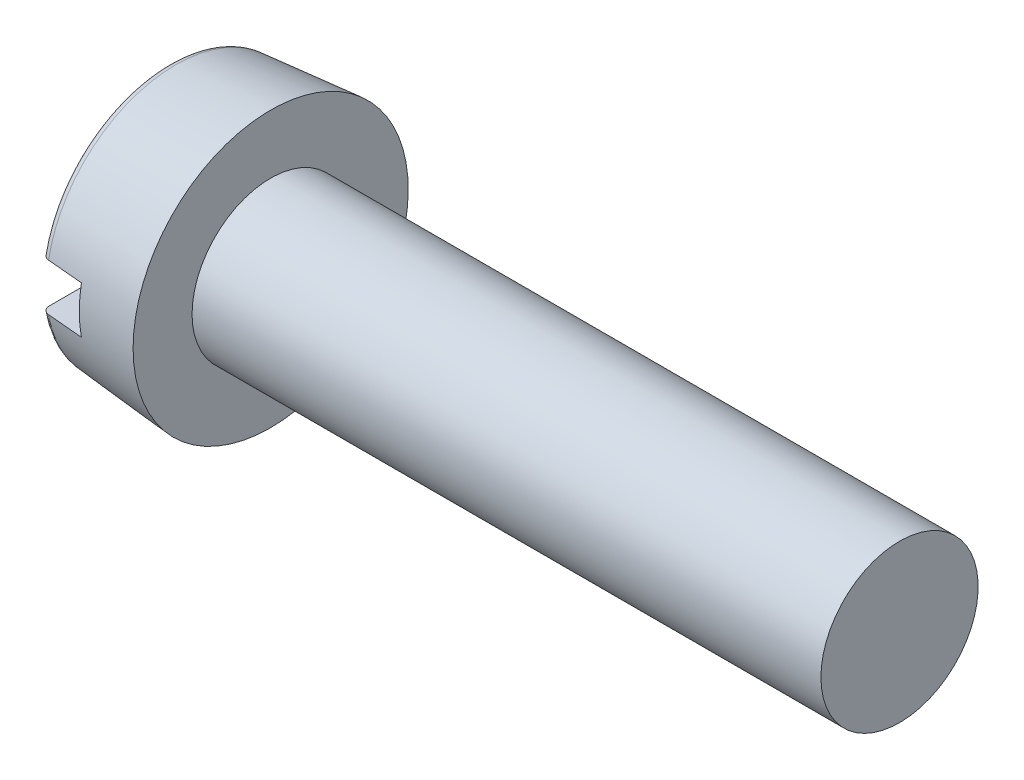
ISO-10303-21;
HEADER;
FILE_DESCRIPTION(('STEP AP214'),'2;1');
FILE_NAME('part.step','',(''),(''),'','','');
FILE_SCHEMA(('AUTOMOTIVE_DESIGN { 1 0 10303 214 1 1 1 1 }'));
ENDSEC;
DATA;
#1=APPLICATION_CONTEXT('core data for automotive mechanical design processes');
#2=APPLICATION_PROTOCOL_DEFINITION('international standard','automotive_design',2000,#1);
#3=PRODUCT_CONTEXT('',#1,'mechanical');
#4=PRODUCT('Part','Part','',(#3));
#5=PRODUCT_RELATED_PRODUCT_CATEGORY('part','',(#4));
#6=PRODUCT_DEFINITION_FORMATION('','',#4);
#7=PRODUCT_DEFINITION_CONTEXT('part definition',#1,'design');
#8=PRODUCT_DEFINITION('design','',#6,#7);
#9=PRODUCT_DEFINITION_SHAPE('','',#8);
#10=(LENGTH_UNIT() NAMED_UNIT(*) SI_UNIT(.MILLI.,.METRE.));
#11=(NAMED_UNIT(*) PLANE_ANGLE_UNIT() SI_UNIT($,.RADIAN.));
#12=(NAMED_UNIT(*) SI_UNIT($,.STERADIAN.) SOLID_ANGLE_UNIT());
#13=UNCERTAINTY_MEASURE_WITH_UNIT(LENGTH_MEASURE(1.E-05),#10,'distance_accuracy_value','');
#14=(GEOMETRIC_REPRESENTATION_CONTEXT(3) GLOBAL_UNCERTAINTY_ASSIGNED_CONTEXT((#13)) GLOBAL_UNIT_ASSIGNED_CONTEXT((#10,
#11,#12)) REPRESENTATION_CONTEXT('',''));
#15=CARTESIAN_POINT('',(0.,0.,0.));
#16=DIRECTION('',(0.,0.,1.));
#17=DIRECTION('',(1.,0.,0.));
#18=AXIS2_PLACEMENT_3D('',#15,#16,#17);
#19=CARTESIAN_POINT('',(0.,0.,0.));
#20=DIRECTION('',(-1.,0.,0.));
#21=DIRECTION('',(0.,0.,0.999999999999998));
#22=AXIS2_PLACEMENT_3D('',#19,#20,#21);
#23=PLANE('',#22);
#24=DIRECTION('',(0.,0.,-0.999999999999998));
#25=VECTOR('',#24,1.);
#26=CARTESIAN_POINT('',(-1.11022302462516E-13,0.599999999999712,3.50000000000017));
#27=LINE('',#26,#25);
#28=CARTESIAN_POINT('',(-1.11022302462516E-13,0.599999999999684,3.03043682762005));
#29=VERTEX_POINT('',#28);
#30=CARTESIAN_POINT('',(0.,0.59999999999949,-3.03043682761961));
#31=VERTEX_POINT('',#30);
#32=EDGE_CURVE('E104',#29,#31,#27,.T.);
#33=ORIENTED_EDGE('',*,*,#32,.F.);
#34=CARTESIAN_POINT('',(0.,0.,0.));
#35=DIRECTION('',(-1.,0.,0.));
#36=DIRECTION('',(0.,0.,0.999999999999998));
#37=AXIS2_PLACEMENT_3D('',#34,#35,#36);
#38=CIRCLE('',#37,3.08926324002911);
#39=EDGE_CURVE('E107',#29,#31,#38,.T.);
#40=ORIENTED_EDGE('',*,*,#39,.T.);
#41=EDGE_LOOP('',(#33,#40));
#42=FACE_BOUND('',#41,.T.);
#43=ADVANCED_FACE('F36',(#42),#23,.T.);
#44=CARTESIAN_POINT('',(0.199999999999978,0.,0.));
#45=DIRECTION('',(-1.,0.,0.));
#46=DIRECTION('',(0.,0.,0.999999999999998));
#47=AXIS2_PLACEMENT_3D('',#44,#45,#46);
#48=TOROIDAL_SURFACE('',#47,3.08926324002911,0.2);
#49=CARTESIAN_POINT('',(0.105953739924614,0.59999999999949,-3.2101816133332));
#50=CARTESIAN_POINT('',(0.115699867045943,0.599999999999428,-3.21546386979094));
#51=CARTESIAN_POINT('',(0.125895408178232,0.599999999999706,-3.21993251953909));
#52=CARTESIAN_POINT('',(0.146899354294396,0.599999999999722,-3.22710008862407));
#53=CARTESIAN_POINT('',(0.157708388392114,0.59999999999946,-3.22979715429949));
#54=CARTESIAN_POINT('',(0.179625454239105,0.599999999999465,-3.2333327645748));
#55=CARTESIAN_POINT('',(0.190733432120329,0.599999999999732,-3.23417164177054));
#56=CARTESIAN_POINT('',(0.212929133747229,0.599999999999696,-3.23396487713403));
#57=CARTESIAN_POINT('',(0.224016861467537,0.599999999999393,-3.23291965678273));
#58=CARTESIAN_POINT('',(0.245821590320158,0.599999999999365,-3.22898503041665));
#59=CARTESIAN_POINT('',(0.256539703296061,0.599999999999638,-3.2261017788437));
#60=CARTESIAN_POINT('',(0.277343592363643,0.59999999999979,-3.2185854079286));
#61=CARTESIAN_POINT('',(0.287429341503128,0.599999999999669,-3.21395221406058));
#62=CARTESIAN_POINT('',(0.30673942272516,0.599999999999644,-3.20304847628398));
#63=CARTESIAN_POINT('',(0.315959181724372,0.599999999999741,-3.19676983855281));
#64=CARTESIAN_POINT('',(0.333231584450119,0.599999999999686,-3.18277301032229));
#65=CARTESIAN_POINT('',(0.341284160551185,0.599999999999534,-3.17505473647099));
#66=CARTESIAN_POINT('',(0.356112180323216,0.599999999999556,-3.15828860043131));
#67=CARTESIAN_POINT('',(0.362868905953963,0.599999999999734,-3.14922418857679));
#68=CARTESIAN_POINT('',(0.374794862409799,0.599999999999693,-3.13010544470098));
#69=CARTESIAN_POINT('',(0.379963956948954,0.599999999999473,-3.12005102779314));
#70=CARTESIAN_POINT('',(0.388661168337957,0.599999999999451,-3.09905295927712));
#71=CARTESIAN_POINT('',(0.392159575363286,0.599999999999655,-3.08809700054731));
#72=CARTESIAN_POINT('',(0.397296414832319,0.599999999999772,-3.06575733688215));
#73=CARTESIAN_POINT('',(0.398934685273749,0.599999999999685,-3.05437359477965));
#74=CARTESIAN_POINT('',(0.400323087242682,0.599999999999683,-3.03132781901716));
#75=CARTESIAN_POINT('',(0.400045903549427,0.59999999999977,-3.01966413315754));
#76=CARTESIAN_POINT('',(0.39754809016835,0.599999999999657,-2.99654632633034));
#77=CARTESIAN_POINT('',(0.395327365836322,0.599999999999457,-2.98509221559614));
#78=CARTESIAN_POINT('',(0.38898399927123,0.599999999999467,-2.9626606901765));
#79=CARTESIAN_POINT('',(0.384851906945176,0.599999999999681,-2.95168594407279));
#80=CARTESIAN_POINT('',(0.3747900182667,0.599999999999747,-2.93059330768538));
#81=CARTESIAN_POINT('',(0.368860259917745,0.5999999999996,-2.92047539929354));
#82=CARTESIAN_POINT('',(0.355413107286112,0.599999999999602,-2.90147355316882));
#83=CARTESIAN_POINT('',(0.347908414694947,0.599999999999749,-2.89258063335523));
#84=CARTESIAN_POINT('',(0.33148746975741,0.599999999999679,-2.87620998760392));
#85=CARTESIAN_POINT('',(0.322571354556344,0.599999999999462,-2.86873212432262));
#86=CARTESIAN_POINT('',(0.303753328633121,0.599999999999462,-2.8555529247935));
#87=CARTESIAN_POINT('',(0.293872414746334,0.599999999999671,-2.84982161574725));
#88=CARTESIAN_POINT('',(0.273273703857204,0.599999999999757,-2.84013920426949));
#89=CARTESIAN_POINT('',(0.262556012822632,0.599999999999634,-2.83618787685236));
#90=CARTESIAN_POINT('',(0.240822786132813,0.599999999999623,-2.83025814283503));
#91=CARTESIAN_POINT('',(0.229817749410711,0.59999999999973,-2.82824122521441));
#92=CARTESIAN_POINT('',(0.207625281800654,0.599999999999697,-2.82610837335135));
#93=CARTESIAN_POINT('',(0.196437866476371,0.599999999999558,-2.8259922777394));
#94=CARTESIAN_POINT('',(0.17433927055856,0.599999999999532,-2.82765455278593));
#95=CARTESIAN_POINT('',(0.163426387110111,0.599999999999643,-2.82941041235537));
#96=CARTESIAN_POINT('',(0.142049246413894,0.599999999999784,-2.8347246947227));
#97=CARTESIAN_POINT('',(0.131584987584616,0.599999999999816,-2.83828311116558));
#98=CARTESIAN_POINT('',(0.111366842835406,0.59999999999983,-2.84710251243708));
#99=CARTESIAN_POINT('',(0.101614994241198,0.599999999999811,-2.85236816263951));
#100=CARTESIAN_POINT('',(0.0831155684833096,0.599999999999616,-2.8644378241263));
#101=CARTESIAN_POINT('',(0.0743680595687293,0.59999999999944,-2.87124193986266));
#102=CARTESIAN_POINT('',(0.0579761548093951,0.599999999999485,-2.88630586312691));
#103=CARTESIAN_POINT('',(0.050351197863599,0.599999999999712,-2.89458681527116));
#104=CARTESIAN_POINT('',(0.0365658813059528,0.599999999999716,-2.91228895426982));
#105=CARTESIAN_POINT('',(0.0304056783706672,0.599999999999492,-2.9217102629393));
#106=CARTESIAN_POINT('',(0.0195922837495004,0.599999999999487,-2.94163340482063));
#107=CARTESIAN_POINT('',(0.0149726728986204,0.599999999999715,-2.95215346822017));
#108=CARTESIAN_POINT('',(0.00753379890288115,0.599999999999713,-2.97381205197585));
#109=CARTESIAN_POINT('',(0.004714708336776,0.599999999999484,-2.98495063150518));
#110=CARTESIAN_POINT('',(0.000917943124891184,0.59999999999944,-3.00771876258964));
#111=CARTESIAN_POINT('',(-2.99512473243826E-05,0.599999999999632,-3.01935328958122));
#112=CARTESIAN_POINT('',(3.13982112445663E-05,0.599999999999795,-3.04261715108144));
#113=CARTESIAN_POINT('',(0.00104065151429112,0.599999999999765,-3.05424648556466));
#114=CARTESIAN_POINT('',(0.0050019968044637,0.59999999999977,-3.07722115411222));
#115=CARTESIAN_POINT('',(0.00796235321831297,0.599999999999805,-3.08856506605241));
#116=CARTESIAN_POINT('',(0.0157616481360369,0.599999999999623,-3.11059162248647));
#117=CARTESIAN_POINT('',(0.0206009998700151,0.599999999999406,-3.12127412092217));
#118=CARTESIAN_POINT('',(0.031987321382284,0.599999999999463,-3.14158024782129));
#119=CARTESIAN_POINT('',(0.0385211782221043,0.599999999999733,-3.15121123387002));
#120=CARTESIAN_POINT('',(0.0531333033533803,0.599999999999695,-3.16920723705604));
#121=CARTESIAN_POINT('',(0.0612095624706411,0.599999999999388,-3.17757387604405));
#122=CARTESIAN_POINT('',(0.0754611155419903,0.599999999999509,-3.18998949809181));
#123=CARTESIAN_POINT('',(0.0812448835915303,0.599999999999708,-3.19449553356716));
#124=CARTESIAN_POINT('',(0.0932716267954818,0.599999999999719,-3.20284662761367));
#125=CARTESIAN_POINT('',(0.0995145970045889,0.59999999999953,-3.20669169330155));
#126=CARTESIAN_POINT('',(0.105953739924614,0.59999999999949,-3.2101816133332));
#127=B_SPLINE_CURVE_WITH_KNOTS('',3,(#49,#50,#51,#52,#53,#54,#55,#56,#57,#58,#59,#60,#61,#62,
#63,#64,#65,#66,#67,#68,#69,#70,#71,#72,#73,#74,#75,#76,#77,#78,#79,#80,#81,#82,#83,#84,#85,#86,
#87,#88,#89,#90,#91,#92,#93,#94,#95,#96,#97,#98,#99,#100,#101,#102,#103,#104,#105,#106,#107,
#108,#109,#110,#111,#112,#113,#114,#115,#116,#117,#118,#119,#120,#121,#122,#123,#124,#125,#126),
.UNSPECIFIED.,.T.,.F.,(4,2,2,2,2,2,2,2,2,2,2,2,2,2,2,2,2,2,2,2,2,2,2,2,2,2,2,2,2,2,2,2,2,2,2,2,
2,2,4),(0.,0.0332301908525012,0.066495096295169,0.0997540471946599,0.133005558843383,
0.166146312183961,0.199288477069043,0.232596829869959,0.265907111754405,0.299667286825976,
0.333430359139759,0.367773335427448,0.402119302470586,0.436956058723522,0.471794511509329,
0.506807082823659,0.541818914008135,0.57655854144983,0.611294795376241,0.64539614741632,
0.679493187912942,0.712896383451858,0.746296743225551,0.779299932151683,0.812303004723996,
0.845397036184844,0.87849331519476,0.912108337274869,0.945726953350482,0.980036628414153,
1.0143495915456,1.04920438211971,1.08405934138549,1.11906289539297,1.15407415177329,
1.18882216315981,1.22352521584405,1.24548021905107,1.26743498585179),.UNSPECIFIED.);
#128=CARTESIAN_POINT('',(0.182568851450515,0.599999999999573,-3.23330273645173));
#129=VERTEX_POINT('',#128);
#130=EDGE_CURVE('E59',#31,#129,#127,.T.);
#131=ORIENTED_EDGE('',*,*,#130,.F.);
#132=ORIENTED_EDGE('',*,*,#39,.F.);
#133=CARTESIAN_POINT('',(0.105016065447994,0.59999999999949,2.85080142016592));
#134=CARTESIAN_POINT('',(0.114691275115852,0.599999999999428,2.84546620238371));
#135=CARTESIAN_POINT('',(0.124818651550061,0.599999999999673,2.8409360981107));
#136=CARTESIAN_POINT('',(0.145696909257451,0.599999999999751,2.83363379340879));
#137=CARTESIAN_POINT('',(0.156448393709047,0.599999999999584,2.83086332554986));
#138=CARTESIAN_POINT('',(0.1782653442354,0.599999999999563,2.82717406899662));
#139=CARTESIAN_POINT('',(0.189330798086022,0.59999999999971,2.8262552083116));
#140=CARTESIAN_POINT('',(0.21145533316114,0.599999999999715,2.82629971920711));
#141=CARTESIAN_POINT('',(0.222514415248727,0.599999999999573,2.82726268082588));
#142=CARTESIAN_POINT('',(0.244256660592042,0.599999999999573,2.83102874748424));
#143=CARTESIAN_POINT('',(0.254941437932415,0.599999999999714,2.83382255113704));
#144=CARTESIAN_POINT('',(0.275695433258423,0.599999999999711,2.84115235021178));
#145=CARTESIAN_POINT('',(0.285764620536109,0.599999999999567,2.84568843246307));
#146=CARTESIAN_POINT('',(0.305080752693093,0.599999999999579,2.85639977553994));
#147=CARTESIAN_POINT('',(0.31432149677772,0.599999999999736,2.86258620929547));
#148=CARTESIAN_POINT('',(0.331656900242053,0.599999999999688,2.87639692459655));
#149=CARTESIAN_POINT('',(0.339751465205207,0.599999999999483,2.88402132447414));
#150=CARTESIAN_POINT('',(0.354722509712995,0.599999999999496,2.90063675497534));
#151=CARTESIAN_POINT('',(0.361574356033981,0.599999999999722,2.90964997613765));
#152=CARTESIAN_POINT('',(0.373703027093206,0.599999999999702,2.92868002833472));
#153=CARTESIAN_POINT('',(0.378979685888635,0.599999999999457,2.93869696496049));
#154=CARTESIAN_POINT('',(0.387916968158396,0.599999999999467,2.95966673422451));
#155=CARTESIAN_POINT('',(0.391542937897882,0.599999999999733,2.97063434297526));
#156=CARTESIAN_POINT('',(0.396928801171301,0.599999999999691,2.99301875217935));
#157=CARTESIAN_POINT('',(0.398688538079598,0.599999999999384,3.00443559025138));
#158=CARTESIAN_POINT('',(0.400306795602736,0.599999999999373,3.02755271561491));
#159=CARTESIAN_POINT('',(0.400140357330214,0.599999999999677,3.03925475866529));
#160=CARTESIAN_POINT('',(0.397847175745727,0.599999999999747,3.06246562385618));
#161=CARTESIAN_POINT('',(0.395720387466214,0.599999999999513,3.07397444155822));
#162=CARTESIAN_POINT('',(0.389555866878829,0.599999999999466,3.0964775069839));
#163=CARTESIAN_POINT('',(0.385516842186203,0.599999999999654,3.10747140116598));
#164=CARTESIAN_POINT('',(0.375630556512179,0.59999999999977,3.12861423150068));
#165=CARTESIAN_POINT('',(0.36978337845516,0.5999999999997,3.13876320637537));
#166=CARTESIAN_POINT('',(0.35651018434263,0.599999999999724,3.15780612490889));
#167=CARTESIAN_POINT('',(0.349102077990701,0.599999999999816,3.16671254604102));
#168=CARTESIAN_POINT('',(0.332872314946527,0.599999999999608,3.18312834289847));
#169=CARTESIAN_POINT('',(0.32405078838672,0.599999999999309,3.19063784709937));
#170=CARTESIAN_POINT('',(0.305405257553077,0.599999999999337,3.20390997137337));
#171=CARTESIAN_POINT('',(0.295600859085626,0.599999999999654,3.20970013456348));
#172=CARTESIAN_POINT('',(0.275147361685879,0.59999999999977,3.21952148852181));
#173=CARTESIAN_POINT('',(0.264498343617907,0.599999999999569,3.22355284743922));
#174=CARTESIAN_POINT('',(0.242839608293598,0.599999999999522,3.22967901305535));
#175=CARTESIAN_POINT('',(0.231838272469383,0.599999999999669,3.23180347303687));
#176=CARTESIAN_POINT('',(0.209634902627099,0.599999999999755,3.2341574607412));
#177=CARTESIAN_POINT('',(0.198432880980165,0.599999999999694,3.23438710486853));
#178=CARTESIAN_POINT('',(0.176248329247496,0.599999999999674,3.2329506854557));
#179=CARTESIAN_POINT('',(0.165264740081931,0.599999999999715,3.23130090476916));
#180=CARTESIAN_POINT('',(0.143729973375273,0.599999999999709,3.22618337046992));
#181=CARTESIAN_POINT('',(0.133178792623996,0.599999999999663,3.22271563035632));
#182=CARTESIAN_POINT('',(0.112787386885636,0.59999999999965,3.21406153511382));
#183=CARTESIAN_POINT('',(0.102948312330149,0.599999999999683,3.20887247143703));
#184=CARTESIAN_POINT('',(0.0842683865466713,0.599999999999741,3.19693335598292));
#185=CARTESIAN_POINT('',(0.0754275788119658,0.599999999999766,3.19018323623129));
#186=CARTESIAN_POINT('',(0.0588875915713345,0.599999999999769,3.17523730199314));
#187=CARTESIAN_POINT('',(0.0512021171343517,0.599999999999745,3.16702632651578));
#188=CARTESIAN_POINT('',(0.0372916813118249,0.599999999999679,3.14944895123256));
#189=CARTESIAN_POINT('',(0.0310668407266701,0.599999999999635,3.14008245595817));
#190=CARTESIAN_POINT('',(0.020143947391513,0.599999999999678,3.12029405807624));
#191=CARTESIAN_POINT('',(0.0154729771461941,0.599999999999767,3.10985720707361));
#192=CARTESIAN_POINT('',(0.0079181159351029,0.599999999999657,3.08835564755405));
#193=CARTESIAN_POINT('',(0.00503438934444969,0.599999999999457,3.07729088138907));
#194=CARTESIAN_POINT('',(0.00109145804325931,0.599999999999468,3.05465747565816));
#195=CARTESIAN_POINT('',(6.22854021730291E-05,0.599999999999685,3.04308359879836));
#196=CARTESIAN_POINT('',(-5.67976143288758E-05,0.599999999999739,3.0199259962042));
#197=CARTESIAN_POINT('',(0.000853346483061738,0.599999999999575,3.00834227020233));
#198=CARTESIAN_POINT('',(0.00460421902106538,0.599999999999571,2.98538851300136));
#199=CARTESIAN_POINT('',(0.00746152900792523,0.599999999999735,2.97402118620057));
#200=CARTESIAN_POINT('',(0.0150510329450386,0.599999999999689,2.95192660316334));
#201=CARTESIAN_POINT('',(0.0197836962461274,0.599999999999479,2.94119950793366));
#202=CARTESIAN_POINT('',(0.0309827140384766,0.599999999999501,2.92073316649912));
#203=CARTESIAN_POINT('',(0.0374439744729217,0.599999999999732,2.91099113179529));
#204=CARTESIAN_POINT('',(0.051930010359211,0.599999999999693,2.89276112216707));
#205=CARTESIAN_POINT('',(0.059952778232779,0.599999999999423,2.88427156135809));
#206=CARTESIAN_POINT('',(0.0742017257543864,0.599999999999532,2.8715922866785));
#207=CARTESIAN_POINT('',(0.08003565351076,0.599999999999712,2.86695454400497));
#208=CARTESIAN_POINT('',(0.0921833209012806,0.599999999999712,2.85835650987236));
#209=CARTESIAN_POINT('',(0.0984970544369484,0.599999999999531,2.85439620980485));
#210=CARTESIAN_POINT('',(0.105016065447994,0.59999999999949,2.85080142016592));
#211=B_SPLINE_CURVE_WITH_KNOTS('',3,(#133,#134,#135,#136,#137,#138,#139,#140,#141,#142,#143,
#144,#145,#146,#147,#148,#149,#150,#151,#152,#153,#154,#155,#156,#157,#158,#159,#160,#161,#162,
#163,#164,#165,#166,#167,#168,#169,#170,#171,#172,#173,#174,#175,#176,#177,#178,#179,#180,#181,
#182,#183,#184,#185,#186,#187,#188,#189,#190,#191,#192,#193,#194,#195,#196,#197,#198,#199,#200,
#201,#202,#203,#204,#205,#206,#207,#208,#209,#210),.UNSPECIFIED.,.T.,.F.,(4,2,2,2,2,2,2,2,2,2,2,
2,2,2,2,2,2,2,2,2,2,2,2,2,2,2,2,2,2,2,2,2,2,2,2,2,2,2,4),(0.,0.0331194464305306,
0.0662714525215271,0.0994221696335378,0.132565665547686,0.165542071601521,0.198520121302564,
0.231727363070972,0.264937338697921,0.298746964424321,0.332560150670279,0.367053714383276,
0.40155017277736,0.436494122663224,0.47143887413191,0.506407276795003,0.541374075997252,
0.575959620974456,0.610541983516759,0.644536067175745,0.678526900142851,0.7119795102465,
0.745430065235379,0.778593002880631,0.811755694280811,0.844970817554095,0.878187387412434,
0.911771263507885,0.945357916148944,0.979502543339116,1.01365031038914,1.04834624952732,
1.08304316324074,1.11803930091584,1.15304420272677,1.18794706261571,1.22280534198677,
1.2451210113294,1.26743639708043),.UNSPECIFIED.);
#212=CARTESIAN_POINT('',(0.182568851450404,0.599999999999601,3.23330273645173));
#213=VERTEX_POINT('',#212);
#214=EDGE_CURVE('E96',#213,#29,#211,.T.);
#215=ORIENTED_EDGE('',*,*,#214,.F.);
#216=CARTESIAN_POINT('',(0.182568851450515,0.,0.));
#217=DIRECTION('',(-1.,0.,0.));
#218=DIRECTION('',(0.,0.,0.999999999999998));
#219=AXIS2_PLACEMENT_3D('',#216,#217,#218);
#220=CIRCLE('',#219,3.28850217964746);
#221=EDGE_CURVE('E111',#129,#213,#220,.F.);
#222=ORIENTED_EDGE('',*,*,#221,.F.);
#223=EDGE_LOOP('',(#131,#132,#215,#222));
#224=FACE_BOUND('',#223,.T.);
#225=ADVANCED_FACE('F188',(#224),#48,.T.);
#226=CARTESIAN_POINT('',(-25.4000000000001,-4.71844785465692E-13,1.11022302462516E-13));
#227=DIRECTION('',(-1.,0.,0.));
#228=DIRECTION('',(0.,0.,0.999999999999998));
#229=AXIS2_PLACEMENT_3D('',#226,#227,#228);
#230=CYLINDRICAL_SURFACE('',#229,2.);
#231=CARTESIAN_POINT('',(18.6,-6.38378239159465E-13,-3.33066907387547E-13));
#232=DIRECTION('',(-1.,0.,0.));
#233=DIRECTION('',(0.,0.,0.999999999999998));
#234=AXIS2_PLACEMENT_3D('',#231,#232,#233);
#235=CIRCLE('',#234,2.);
#236=CARTESIAN_POINT('',(18.6,-6.37490060739765E-13,1.99999999999966));
#237=VERTEX_POINT('',#236);
#238=EDGE_CURVE('E177',#237,#237,#235,.T.);
#239=ORIENTED_EDGE('',*,*,#238,.T.);
#240=EDGE_LOOP('',(#239));
#241=FACE_BOUND('',#240,.T.);
#242=CARTESIAN_POINT('',(2.60000000000005,0.,0.));
#243=DIRECTION('',(-1.,0.,0.));
#244=DIRECTION('',(0.,0.,0.999999999999998));
#245=AXIS2_PLACEMENT_3D('',#242,#243,#244);
#246=CIRCLE('',#245,2.);
#247=CARTESIAN_POINT('',(2.60000000000005,0.,2.));
#248=VERTEX_POINT('',#247);
#249=EDGE_CURVE('E108',#248,#248,#246,.T.);
#250=ORIENTED_EDGE('',*,*,#249,.F.);
#251=EDGE_LOOP('',(#250));
#252=FACE_BOUND('',#251,.T.);
#253=ADVANCED_FACE('F38',(#241,#252),#230,.T.);
#254=CARTESIAN_POINT('',(2.60000000000005,1.99999999999978,1.11022302462516E-13));
#255=DIRECTION('',(-1.,0.,0.));
#256=DIRECTION('',(0.,0.,0.999999999999998));
#257=AXIS2_PLACEMENT_3D('',#254,#255,#256);
#258=PLANE('',#257);
#259=CARTESIAN_POINT('',(2.60000000000005,0.,0.));
#260=DIRECTION('',(-1.,0.,0.));
#261=DIRECTION('',(0.,0.,0.999999999999998));
#262=AXIS2_PLACEMENT_3D('',#259,#260,#261);
#263=CIRCLE('',#262,3.5);
#264=CARTESIAN_POINT('',(2.60000000000005,0.,3.49999999999999));
#265=VERTEX_POINT('',#264);
#266=EDGE_CURVE('E113',#265,#265,#263,.T.);
#267=ORIENTED_EDGE('',*,*,#266,.F.);
#268=EDGE_LOOP('',(#267));
#269=FACE_BOUND('',#268,.T.);
#270=ORIENTED_EDGE('',*,*,#249,.T.);
#271=EDGE_LOOP('',(#270));
#272=FACE_BOUND('',#271,.T.);
#273=ADVANCED_FACE('F160',(#269,#272),#258,.F.);
#274=CARTESIAN_POINT('',(0.,0.,0.));
#275=DIRECTION('',(1.,0.,0.));
#276=DIRECTION('',(0.,0.,-0.999999999999998));
#277=AXIS2_PLACEMENT_3D('',#274,#275,#276);
#278=CONICAL_SURFACE('',#277,3.2725294748326,0.0872664625997168);
#279=CARTESIAN_POINT('',(-5.50655611358541,0.599999999999434,-2.72550680946004));
#280=CARTESIAN_POINT('',(-3.80202221286194,0.599999999998411,-2.87818079834154));
#281=CARTESIAN_POINT('',(-2.09744098836557,0.59999999999885,-3.03032472046517));
#282=CARTESIAN_POINT('',(-0.0673819184161847,0.599999999999579,-3.21106383740281));
#283=CARTESIAN_POINT('',(0.258063353634868,0.599999999999702,-3.24002475934077));
#284=CARTESIAN_POINT('',(2.61358356750997,0.600000000000575,-3.44954593728619));
#285=CARTESIAN_POINT('',(4.64370165689786,0.600000000001226,-3.62962140556573));
#286=CARTESIAN_POINT('',(6.67384119892989,0.599999999999601,-3.80945351066753));
#287=B_SPLINE_CURVE_WITH_KNOTS('',3,(#279,#280,#281,#282,#283,#284,#285,#286),.UNSPECIFIED.,.F.,
.F.,(4,2,2,4),(0.,5.13407279571681,6.11426677611149,12.2285333949971),.UNSPECIFIED.);
#288=CARTESIAN_POINT('',(1.09999999999999,0.59999999999974,-3.31490439259263));
#289=VERTEX_POINT('',#288);
#290=EDGE_CURVE('E171',#129,#289,#287,.T.);
#291=ORIENTED_EDGE('',*,*,#290,.F.);
#292=ORIENTED_EDGE('',*,*,#221,.T.);
#293=CARTESIAN_POINT('',(6.67384119892978,0.599999999999545,3.80945351066786));
#294=CARTESIAN_POINT('',(5.65877031057507,0.599999999999893,3.71954954956559));
#295=CARTESIAN_POINT('',(4.6437058373882,0.599999999999846,3.629573075256));
#296=CARTESIAN_POINT('',(2.61359396495446,0.599999999999577,3.44942842856388));
#297=CARTESIAN_POINT('',(1.59854656570656,0.599999999999355,3.35926025619294));
#298=CARTESIAN_POINT('',(-0.431527065781115,0.599999999999347,3.17868552838777));
#299=CARTESIAN_POINT('',(-1.44655329802031,0.599999999999562,3.08827897294701));
#300=CARTESIAN_POINT('',(-3.47657760028887,0.599999999999862,2.90714957769343));
#301=CARTESIAN_POINT('',(-4.4915756703165,0.599999999999947,2.81642673786131));
#302=CARTESIAN_POINT('',(-5.50655611358553,0.599999999999684,2.72550680946004));
#303=B_SPLINE_CURVE_WITH_KNOTS('',3,(#293,#294,#295,#296,#297,#298,#299,#300,#301,#302),
.UNSPECIFIED.,.F.,.F.,(4,2,2,2,4),(0.,3.05713341552755,6.11426664614623,9.17139996032337,
12.2285334610066),.UNSPECIFIED.);
#304=CARTESIAN_POINT('',(1.09999999999988,0.599999999999518,3.31490439259263));
#305=VERTEX_POINT('',#304);
#306=EDGE_CURVE('E166',#305,#213,#303,.T.);
#307=ORIENTED_EDGE('',*,*,#306,.F.);
#308=CARTESIAN_POINT('',(1.09999999999999,0.,0.));
#309=DIRECTION('',(-1.,0.,0.));
#310=DIRECTION('',(0.,0.,0.999999999999998));
#311=AXIS2_PLACEMENT_3D('',#308,#309,#310);
#312=CIRCLE('',#311,3.36876700471111);
#313=CARTESIAN_POINT('',(1.09999999999988,-0.600000000000461,3.31490439259285));
#314=VERTEX_POINT('',#313);
#315=EDGE_CURVE('E40',#305,#314,#312,.F.);
#316=ORIENTED_EDGE('',*,*,#315,.T.);
#317=CARTESIAN_POINT('',(-5.50655611358553,-0.6000000000006,2.72550680946004));
#318=CARTESIAN_POINT('',(-3.80202221286196,-0.599999999999867,2.87818079834045));
#319=CARTESIAN_POINT('',(-2.09744098836563,-0.599999999999948,3.0303247204644));
#320=CARTESIAN_POINT('',(-0.0673819184162952,-0.600000000000262,3.2110638374027));
#321=CARTESIAN_POINT('',(0.258063353634757,-0.600000000000319,3.24002475934076));
#322=CARTESIAN_POINT('',(2.6135835675098,-0.600000000000747,3.449545937287));
#323=CARTESIAN_POINT('',(4.64370165689764,-0.600000000001205,3.62962140556725));
#324=CARTESIAN_POINT('',(6.67384119892978,-0.600000000000683,3.80945351066775));
#325=B_SPLINE_CURVE_WITH_KNOTS('',3,(#317,#318,#319,#320,#321,#322,#323,#324),.UNSPECIFIED.,.F.,
.F.,(4,2,2,4),(0.,5.1340727957168,6.1142667761115,12.2285333949971),.UNSPECIFIED.);
#326=CARTESIAN_POINT('',(0.182568851450404,-0.600000000000378,3.23330273645195));
#327=VERTEX_POINT('',#326);
#328=EDGE_CURVE('E142',#327,#314,#325,.T.);
#329=ORIENTED_EDGE('',*,*,#328,.F.);
#330=CARTESIAN_POINT('',(0.182568851450848,-0.600000000000517,-3.23330273645983));
#331=VERTEX_POINT('',#330);
#332=EDGE_CURVE('E117',#327,#331,#220,.F.);
#333=ORIENTED_EDGE('',*,*,#332,.T.);
#334=CARTESIAN_POINT('',(6.67384119892989,-0.600000000000267,-3.80945351066764));
#335=CARTESIAN_POINT('',(5.65877031057516,-0.60000000000027,-3.71954954956559));
#336=CARTESIAN_POINT('',(4.64370583738829,-0.600000000000324,-3.62957307525598));
#337=CARTESIAN_POINT('',(2.61359396495456,-0.600000000000432,-3.4494284285637));
#338=CARTESIAN_POINT('',(1.59854656570667,-0.600000000000486,-3.35926025619262));
#339=CARTESIAN_POINT('',(-0.431527065781,-0.600000000000492,-3.17868552838743));
#340=CARTESIAN_POINT('',(-1.44655329802021,-0.600000000000444,-3.08827897294679));
#341=CARTESIAN_POINT('',(-3.47657760028877,-0.600000000000312,-2.9071495776934));
#342=CARTESIAN_POINT('',(-4.49157567031641,-0.600000000000227,-2.81642673786134));
#343=CARTESIAN_POINT('',(-5.50655611358541,-0.600000000000156,-2.72550680945993));
#344=B_SPLINE_CURVE_WITH_KNOTS('',3,(#334,#335,#336,#337,#338,#339,#340,#341,#342,#343),
.UNSPECIFIED.,.F.,.F.,(4,2,2,2,4),(0.,3.05713341552755,6.11426664614623,9.17139996032337,
12.2285334610066),.UNSPECIFIED.);
#345=CARTESIAN_POINT('',(1.09999999999999,-0.600000000000378,-3.31490439259252));
#346=VERTEX_POINT('',#345);
#347=EDGE_CURVE('E91',#346,#331,#344,.T.);
#348=ORIENTED_EDGE('',*,*,#347,.F.);
#349=EDGE_CURVE('E11',#346,#289,#312,.F.);
#350=ORIENTED_EDGE('',*,*,#349,.T.);
#351=EDGE_LOOP('',(#291,#292,#307,#316,#329,#333,#348,#350));
#352=FACE_BOUND('',#351,.T.);
#353=ORIENTED_EDGE('',*,*,#266,.T.);
#354=EDGE_LOOP('',(#353));
#355=FACE_BOUND('',#354,.T.);
#356=ADVANCED_FACE('F156',(#352,#355),#278,.T.);
#357=DIRECTION('',(0.,0.,0.999999999999998));
#358=VECTOR('',#357,1.);
#359=CARTESIAN_POINT('',(0.,-0.600000000000378,-3.50000000000006));
#360=LINE('',#359,#358);
#361=CARTESIAN_POINT('',(0.,-0.600000000000406,-3.03043682762005));
#362=VERTEX_POINT('',#361);
#363=CARTESIAN_POINT('',(-1.11022302462516E-13,-0.600000000000156,3.03043682762016));
#364=VERTEX_POINT('',#363);
#365=EDGE_CURVE('E51',#362,#364,#360,.T.);
#366=ORIENTED_EDGE('',*,*,#365,.F.);
#367=EDGE_CURVE('E102',#362,#364,#38,.T.);
#368=ORIENTED_EDGE('',*,*,#367,.T.);
#369=EDGE_LOOP('',(#366,#368));
#370=FACE_BOUND('',#369,.T.);
#371=ADVANCED_FACE('F101',(#370),#23,.T.);
#372=CARTESIAN_POINT('',(18.6,1.99999999999945,-2.22044604925031E-13));
#373=DIRECTION('',(1.,0.,0.));
#374=DIRECTION('',(0.,0.,-0.999999999999998));
#375=AXIS2_PLACEMENT_3D('',#372,#373,#374);
#376=PLANE('',#375);
#377=ORIENTED_EDGE('',*,*,#238,.F.);
#378=EDGE_LOOP('',(#377));
#379=FACE_BOUND('',#378,.T.);
#380=ADVANCED_FACE('F200',(#379),#376,.T.);
#381=CARTESIAN_POINT('',(0.105953739924614,-0.600000000000406,-3.21018161333342));
#382=CARTESIAN_POINT('',(0.0960146618542925,-0.600000000000408,-3.20479360339786));
#383=CARTESIAN_POINT('',(0.0865284170266621,-0.60000000000029,-3.19855129108828));
#384=CARTESIAN_POINT('',(0.0687367367622543,-0.600000000000467,-3.18455028496763));
#385=CARTESIAN_POINT('',(0.0604329486085487,-0.600000000000763,-3.17678951080994));
#386=CARTESIAN_POINT('',(0.04524977791317,-0.60000000000077,-3.15999804492353));
#387=CARTESIAN_POINT('',(0.0383686903572345,-0.600000000000483,-3.15096889532251));
#388=CARTESIAN_POINT('',(0.0261997611733311,-0.600000000000273,-3.13189878604728));
#389=CARTESIAN_POINT('',(0.020911534374225,-0.60000000000035,-3.12185807176541));
#390=CARTESIAN_POINT('',(0.0120001049688162,-0.600000000000406,-3.1009108106675));
#391=CARTESIAN_POINT('',(0.00839912124313514,-0.600000000000383,-3.0899948126959));
#392=CARTESIAN_POINT('',(0.00305136045385854,-0.600000000000373,-3.06771714571569));
#393=CARTESIAN_POINT('',(0.00130482019864097,-0.600000000000387,-3.05635541998067));
#394=CARTESIAN_POINT('',(-0.000304679946429921,-0.600000000000369,-3.03333344739569));
#395=CARTESIAN_POINT('',(-0.000139980543429312,-0.600000000000336,-3.02167126047605));
#396=CARTESIAN_POINT('',(0.0021335068937899,-0.60000000000042,-2.99853754259364));
#397=CARTESIAN_POINT('',(0.00424239097890153,-0.600000000000535,-2.98706602107905));
#398=CARTESIAN_POINT('',(0.0103660386809723,-0.600000000000498,-2.9645768908558));
#399=CARTESIAN_POINT('',(0.0143909149479558,-0.600000000000344,-2.95356203174778));
#400=CARTESIAN_POINT('',(0.0242460029836994,-0.600000000000412,-2.93237123902907));
#401=CARTESIAN_POINT('',(0.0300761763698061,-0.600000000000634,-2.92219528758807));
#402=CARTESIAN_POINT('',(0.0433378894577733,-0.600000000000621,-2.90305748536846));
#403=CARTESIAN_POINT('',(0.0507572511513492,-0.600000000000389,-2.89408720203752));
#404=CARTESIAN_POINT('',(0.0670217418776104,-0.600000000000367,-2.87754799018385));
#405=CARTESIAN_POINT('',(0.0758667368008552,-0.600000000000577,-2.86997892999169));
#406=CARTESIAN_POINT('',(0.0945622755237476,-0.600000000000567,-2.85660637563635));
#407=CARTESIAN_POINT('',(0.104391762345462,-0.600000000000355,-2.85077345075941));
#408=CARTESIAN_POINT('',(0.124905886398109,-0.600000000000402,-2.84088065766191));
#409=CARTESIAN_POINT('',(0.135590414759096,-0.600000000000661,-2.83682056413559));
#410=CARTESIAN_POINT('',(0.157276189045059,-0.60000000000065,-2.83067225228863));
#411=CARTESIAN_POINT('',(0.168266495799288,-0.600000000000391,-2.82854542143829));
#412=CARTESIAN_POINT('',(0.190448437808147,-0.600000000000366,-2.82619258249696));
#413=CARTESIAN_POINT('',(0.201640055542925,-0.6000000000006,-2.82596640978839));
#414=CARTESIAN_POINT('',(0.223761324574284,-0.6000000000006,-2.82741304710889));
#415=CARTESIAN_POINT('',(0.234692505443503,-0.60000000000037,-2.82906261712954));
#416=CARTESIAN_POINT('',(0.256123508192936,-0.600000000000386,-2.8341697109786));
#417=CARTESIAN_POINT('',(0.266623332828771,-0.600000000000633,-2.83762722325545));
#418=CARTESIAN_POINT('',(0.28692403032649,-0.600000000000678,-2.84625101601592));
#419=CARTESIAN_POINT('',(0.296723226009972,-0.600000000000477,-2.85142124018543));
#420=CARTESIAN_POINT('',(0.315332130993469,-0.60000000000028,-2.86330962780321));
#421=CARTESIAN_POINT('',(0.324141773616916,-0.600000000000284,-2.87002789546645));
#422=CARTESIAN_POINT('',(0.340669477271488,-0.600000000000305,-2.8849285142591));
#423=CARTESIAN_POINT('',(0.3483686473262,-0.600000000000321,-2.89313181096713));
#424=CARTESIAN_POINT('',(0.362314107652588,-0.600000000000435,-2.91069187576611));
#425=CARTESIAN_POINT('',(0.368560245998167,-0.600000000000533,-2.92004876431797));
#426=CARTESIAN_POINT('',(0.379556888858339,-0.6000000000005,-2.93985667013803));
#427=CARTESIAN_POINT('',(0.384274009037408,-0.600000000000365,-2.95032622488918));
#428=CARTESIAN_POINT('',(0.39191537756329,-0.600000000000391,-2.97190043513599));
#429=CARTESIAN_POINT('',(0.394839454356094,-0.600000000000553,-2.98300515129123));
#430=CARTESIAN_POINT('',(0.398853340933687,-0.600000000000536,-3.00572547316171));
#431=CARTESIAN_POINT('',(0.399913002084083,-0.600000000000352,-3.01734641447351));
#432=CARTESIAN_POINT('',(0.400076708246904,-0.600000000000404,-3.0406024381321));
#433=CARTESIAN_POINT('',(0.399180668304734,-0.60000000000064,-3.05223752107124));
#434=CARTESIAN_POINT('',(0.395443752107658,-0.600000000000616,-3.07524842234572));
#435=CARTESIAN_POINT('',(0.392593678469591,-0.600000000000354,-3.08662275054704));
#436=CARTESIAN_POINT('',(0.385009842307816,-0.600000000000402,-3.10872565977277));
#437=CARTESIAN_POINT('',(0.38027612350049,-0.600000000000711,-3.11945425577694));
#438=CARTESIAN_POINT('',(0.369091746314166,-0.600000000000711,-3.13986909205459));
#439=CARTESIAN_POINT('',(0.362654558175529,-0.600000000000407,-3.14956270724319));
#440=CARTESIAN_POINT('',(0.348219641667818,-0.600000000000349,-3.16770913317543));
#441=CARTESIAN_POINT('',(0.340222038129084,-0.600000000000597,-3.17616204307847));
#442=CARTESIAN_POINT('',(0.323027713733748,-0.600000000000659,-3.19144232634916));
#443=CARTESIAN_POINT('',(0.313851993106472,-0.60000000000048,-3.1982933269288));
#444=CARTESIAN_POINT('',(0.294464733319713,-0.600000000000276,-3.21032583438508));
#445=CARTESIAN_POINT('',(0.284253338931838,-0.60000000000025,-3.21550757417751));
#446=CARTESIAN_POINT('',(0.263272267687669,-0.600000000000284,-3.22396402505647));
#447=CARTESIAN_POINT('',(0.252515098202325,-0.600000000000343,-3.22726978313982));
#448=CARTESIAN_POINT('',(0.230592461086709,-0.600000000000413,-3.23200581466699));
#449=CARTESIAN_POINT('',(0.219426919130789,-0.600000000000423,-3.23343574493802));
#450=CARTESIAN_POINT('',(0.197138795801613,-0.600000000000389,-3.23436881312323));
#451=CARTESIAN_POINT('',(0.186017066192531,-0.600000000000344,-3.23389272118821));
#452=CARTESIAN_POINT('',(0.164022425479279,-0.600000000000412,-3.23107504671006));
#453=CARTESIAN_POINT('',(0.15314921591011,-0.600000000000524,-3.22873583752506));
#454=CARTESIAN_POINT('',(0.136218230401851,-0.600000000000468,-3.22357289305467));
#455=CARTESIAN_POINT('',(0.129980173342267,-0.600000000000394,-3.22132097966634));
#456=CARTESIAN_POINT('',(0.117760799844487,-0.600000000000362,-3.21620441428493));
#457=CARTESIAN_POINT('',(0.111779480840438,-0.600000000000405,-3.21333976841726));
#458=CARTESIAN_POINT('',(0.105953739924614,-0.600000000000406,-3.21018161333342));
#459=B_SPLINE_CURVE_WITH_KNOTS('',3,(#381,#382,#383,#384,#385,#386,#387,#388,#389,#390,#391,
#392,#393,#394,#395,#396,#397,#398,#399,#400,#401,#402,#403,#404,#405,#406,#407,#408,#409,#410,
#411,#412,#413,#414,#415,#416,#417,#418,#419,#420,#421,#422,#423,#424,#425,#426,#427,#428,#429,
#430,#431,#432,#433,#434,#435,#436,#437,#438,#439,#440,#441,#442,#443,#444,#445,#446,#447,#448,
#449,#450,#451,#452,#453,#454,#455,#456,#457,#458),.UNSPECIFIED.,.T.,.F.,(4,2,2,2,2,2,2,2,2,2,2,
2,2,2,2,2,2,2,2,2,2,2,2,2,2,2,2,2,2,2,2,2,2,2,2,2,2,2,4),(0.,0.0338920164903211,
0.0678307955537167,0.101728662370783,0.135618325720563,0.169942532430376,0.204271121739411,
0.239097123603665,0.273924846110964,0.308938463396135,0.34395133630341,0.378704934761654,
0.413455265851922,0.447577695206543,0.481695786743465,0.515116434934439,0.548534188505509,
0.581542373218836,0.614550347034082,0.647634859439646,0.680721599760199,0.714317665276493,
0.747917241953132,0.782207506600596,0.816501051545093,0.851344214596257,0.886188891245665,
0.92119871350363,0.956207723287163,0.990947767272489,1.02568503325732,1.05987207129262,
1.09405433706358,1.12765303455329,1.16125787789037,1.19449752744771,1.22769490180179,
1.247560736395,1.26742637240173),.UNSPECIFIED.);
#460=EDGE_CURVE('E87',#331,#362,#459,.T.);
#461=ORIENTED_EDGE('',*,*,#460,.F.);
#462=ORIENTED_EDGE('',*,*,#332,.F.);
#463=CARTESIAN_POINT('',(0.105016065447994,-0.600000000000656,2.85080142016592));
#464=CARTESIAN_POINT('',(0.0950844359037597,-0.600000000000736,2.85627921699541));
#465=CARTESIAN_POINT('',(0.0856147176031799,-0.600000000000382,2.86261371529383));
#466=CARTESIAN_POINT('',(0.0678721415465151,-0.600000000000378,2.87679618747284));
#467=CARTESIAN_POINT('',(0.0596010298743502,-0.600000000000729,2.88464633124864));
#468=CARTESIAN_POINT('',(0.044496873840002,-0.600000000000748,2.90160680808773));
#469=CARTESIAN_POINT('',(0.0376618909553713,-0.600000000000417,2.91071541454008));
#470=CARTESIAN_POINT('',(0.0255937188090438,-0.600000000000342,2.92993348157155));
#471=CARTESIAN_POINT('',(0.0203601327309959,-0.600000000000598,2.94004269338372));
#472=CARTESIAN_POINT('',(0.0115562151355811,-0.600000000000602,2.96113928931903));
#473=CARTESIAN_POINT('',(0.00801194366997493,-0.600000000000344,2.97213755049151));
#474=CARTESIAN_POINT('',(0.00279364095245295,-0.600000000000416,2.99456990747089));
#475=CARTESIAN_POINT('',(0.00111984467929504,-0.600000000000747,3.0060040578499));
#476=CARTESIAN_POINT('',(-0.000322843404619256,-0.600000000000786,3.02913901624728));
#477=CARTESIAN_POINT('',(-6.7158584093647E-05,-0.600000000000486,3.0408413651681));
#478=CARTESIAN_POINT('',(0.00240390872757244,-0.600000000000274,3.0640377491683));
#479=CARTESIAN_POINT('',(0.00461933111597933,-0.600000000000362,3.07553178000178));
#480=CARTESIAN_POINT('',(0.0109573040703809,-0.600000000000394,3.09798695563772));
#481=CARTESIAN_POINT('',(0.0150805892007347,-0.600000000000338,3.10894789339101));
#482=CARTESIAN_POINT('',(0.0251289662586371,-0.600000000000421,3.13001071827786));
#483=CARTESIAN_POINT('',(0.0310539683858874,-0.60000000000056,3.14011264819356));
#484=CARTESIAN_POINT('',(0.0444717960667078,-0.600000000000529,3.15904704586022));
#485=CARTESIAN_POINT('',(0.0519464627991144,-0.600000000000363,3.16789237594704));
#486=CARTESIAN_POINT('',(0.0682980136523551,-0.600000000000396,3.18417542375203));
#487=CARTESIAN_POINT('',(0.0771747697929356,-0.600000000000595,3.19161326980679));
#488=CARTESIAN_POINT('',(0.0959162477014908,-0.600000000000605,3.20473451267704));
#489=CARTESIAN_POINT('',(0.105761523553067,-0.600000000000424,3.21044568460977));
#490=CARTESIAN_POINT('',(0.126282602359413,-0.600000000000336,3.22010343385777));
#491=CARTESIAN_POINT('',(0.136958325701934,-0.600000000000429,3.22405018007854));
#492=CARTESIAN_POINT('',(0.158656331323836,-0.600000000000383,3.23000588829848));
#493=CARTESIAN_POINT('',(0.169670522230588,-0.600000000000248,3.2320443510365));
#494=CARTESIAN_POINT('',(0.191884836266211,-0.600000000000511,3.23422584003542));
#495=CARTESIAN_POINT('',(0.203084948187445,-0.600000000000909,3.23436898013715));
#496=CARTESIAN_POINT('',(0.225253590897237,-0.600000000000847,3.23276234649824));
#497=CARTESIAN_POINT('',(0.23622327607514,-0.600000000000395,3.23102843657138));
#498=CARTESIAN_POINT('',(0.257716469853241,-0.600000000000365,3.22574661361592));
#499=CARTESIAN_POINT('',(0.268239981400543,-0.600000000000787,3.22219871257128));
#500=CARTESIAN_POINT('',(0.288565716875215,-0.600000000000857,3.21338945035973));
#501=CARTESIAN_POINT('',(0.298366595276049,-0.600000000000504,3.20812498709312));
#502=CARTESIAN_POINT('',(0.316958373459791,-0.600000000000256,3.19604273598005));
#503=CARTESIAN_POINT('',(0.325749227068279,-0.600000000000362,3.18922487716084));
#504=CARTESIAN_POINT('',(0.342180024746088,-0.600000000000394,3.1741508549639));
#505=CARTESIAN_POINT('',(0.349805923683242,-0.600000000000318,3.16587938802094));
#506=CARTESIAN_POINT('',(0.363588137398276,-0.600000000000442,3.14819177364365));
#507=CARTESIAN_POINT('',(0.369744332747529,-0.600000000000642,3.1387755332784));
#508=CARTESIAN_POINT('',(0.380521922402011,-0.600000000000613,3.11889822880207));
#509=CARTESIAN_POINT('',(0.385116011501849,-0.600000000000377,3.1084223602277));
#510=CARTESIAN_POINT('',(0.392511552424275,-0.600000000000382,3.08685595572801));
#511=CARTESIAN_POINT('',(0.395312841732324,-0.600000000000624,3.07576536417801));
#512=CARTESIAN_POINT('',(0.399085841487942,-0.600000000000632,3.0530950982223));
#513=CARTESIAN_POINT('',(0.400027673095738,-0.600000000000391,3.04151044551975));
#514=CARTESIAN_POINT('',(0.399971081295065,-0.600000000000369,3.01834558617753));
#515=CARTESIAN_POINT('',(0.398972534517126,-0.600000000000589,3.0067653798674));
#516=CARTESIAN_POINT('',(0.395045316840861,-0.600000000000612,2.98383505011771));
#517=CARTESIAN_POINT('',(0.392100324867714,-0.600000000000412,2.97248771618864));
#518=CARTESIAN_POINT('',(0.384340465528655,-0.600000000000348,2.95045082340877));
#519=CARTESIAN_POINT('',(0.379525587889957,-0.600000000000485,2.93976126817205));
#520=CARTESIAN_POINT('',(0.368172829623228,-0.600000000000549,2.91939094249102));
#521=CARTESIAN_POINT('',(0.361641377002605,-0.600000000000477,2.90970659276624));
#522=CARTESIAN_POINT('',(0.347021321192159,-0.600000000000283,2.89159401652031));
#523=CARTESIAN_POINT('',(0.338932833295112,-0.60000000000016,2.88316569707664));
#524=CARTESIAN_POINT('',(0.321559831477378,-0.600000000000152,2.86794978283428));
#525=CARTESIAN_POINT('',(0.312295962977344,-0.600000000000264,2.86113862577594));
#526=CARTESIAN_POINT('',(0.292736762492896,-0.600000000000496,2.84920768805522));
#527=CARTESIAN_POINT('',(0.2824416015423,-0.600000000000616,2.84408762753763));
#528=CARTESIAN_POINT('',(0.261343912555239,-0.600000000000585,2.8357958275461));
#529=CARTESIAN_POINT('',(0.25055654905956,-0.600000000000439,2.83258548724939));
#530=CARTESIAN_POINT('',(0.228589176392208,-0.600000000000321,2.82805287629772));
#531=CARTESIAN_POINT('',(0.217409106466396,-0.600000000000348,2.82673089911421));
#532=CARTESIAN_POINT('',(0.195158229503667,-0.600000000000352,2.82602507721816));
#533=CARTESIAN_POINT('',(0.184088310375227,-0.600000000000328,2.82661236303335));
#534=CARTESIAN_POINT('',(0.162215566139683,-0.600000000000431,2.82964288436693));
#535=CARTESIAN_POINT('',(0.151412416735305,-0.600000000000558,2.83208373899797));
#536=CARTESIAN_POINT('',(0.134680933971379,-0.600000000000448,2.83737290890137));
#537=CARTESIAN_POINT('',(0.128564913743165,-0.600000000000339,2.839646900791));
#538=CARTESIAN_POINT('',(0.116587073879074,-0.60000000000042,2.84478670892181));
#539=CARTESIAN_POINT('',(0.110725250131516,-0.600000000000609,2.84765251558595));
#540=CARTESIAN_POINT('',(0.105016065447994,-0.600000000000656,2.85080142016592));
#541=B_SPLINE_CURVE_WITH_KNOTS('',3,(#463,#464,#465,#466,#467,#468,#469,#470,#471,#472,#473,
#474,#475,#476,#477,#478,#479,#480,#481,#482,#483,#484,#485,#486,#487,#488,#489,#490,#491,#492,
#493,#494,#495,#496,#497,#498,#499,#500,#501,#502,#503,#504,#505,#506,#507,#508,#509,#510,#511,
#512,#513,#514,#515,#516,#517,#518,#519,#520,#521,#522,#523,#524,#525,#526,#527,#528,#529,#530,
#531,#532,#533,#534,#535,#536,#537,#538,#539,#540),.UNSPECIFIED.,.T.,.F.,(4,2,2,2,2,2,2,2,2,2,2,
2,2,2,2,2,2,2,2,2,2,2,2,2,2,2,2,2,2,2,2,2,2,2,2,2,2,2,4),(0.,0.0340019229053699,
0.0680528910274183,0.102057596759262,0.136053869496161,0.170558847497803,0.20506815970594,
0.240017766916769,0.274968085664645,0.309931872178405,0.344893916329745,0.379467347693609,
0.414037625077275,0.448017927329085,0.481994976007181,0.515437641622702,0.548878298525894,
0.582038523767294,0.615198529941754,0.648418796739492,0.68164058163533,0.715235737354883,
0.748833622100051,0.782991763799828,0.817153001444103,0.851858833146756,0.886566871522174,
0.921569695370515,0.956572711520241,0.991446475646121,1.02631765848971,1.0606443934663,
1.09496544495029,1.12856686257092,1.16217350163664,1.19527436061211,1.22833277368976,
1.24787905235469,1.2674250147365),.UNSPECIFIED.);
#542=EDGE_CURVE('E97',#364,#327,#541,.T.);
#543=ORIENTED_EDGE('',*,*,#542,.F.);
#544=ORIENTED_EDGE('',*,*,#367,.F.);
#545=EDGE_LOOP('',(#461,#462,#543,#544));
#546=FACE_BOUND('',#545,.T.);
#547=ADVANCED_FACE('F106',(#546),#48,.T.);
#548=CARTESIAN_POINT('',(1.09999999999988,0.599999999999712,3.50000000000017));
#549=DIRECTION('',(0.,0.999999999999999,0.));
#550=DIRECTION('',(0.,0.,0.999999999999998));
#551=AXIS2_PLACEMENT_3D('',#548,#549,#550);
#552=PLANE('',#551);
#553=ORIENTED_EDGE('',*,*,#290,.T.);
#554=DIRECTION('',(0.,0.,-0.999999999999998));
#555=VECTOR('',#554,1.);
#556=CARTESIAN_POINT('',(1.09999999999988,0.599999999999712,3.50000000000017));
#557=LINE('',#556,#555);
#558=EDGE_CURVE('E103',#305,#289,#557,.T.);
#559=ORIENTED_EDGE('',*,*,#558,.F.);
#560=ORIENTED_EDGE('',*,*,#306,.T.);
#561=ORIENTED_EDGE('',*,*,#214,.T.);
#562=ORIENTED_EDGE('',*,*,#32,.T.);
#563=ORIENTED_EDGE('',*,*,#130,.T.);
#564=EDGE_LOOP('',(#553,#559,#560,#561,#562,#563));
#565=FACE_BOUND('',#564,.T.);
#566=ADVANCED_FACE('F135',(#565),#552,.F.);
#567=CARTESIAN_POINT('',(1.09999999999999,-0.600000000000378,-3.50000000000006));
#568=DIRECTION('',(0.,-0.999999999999999,0.));
#569=DIRECTION('',(0.,0.,-0.999999999999998));
#570=AXIS2_PLACEMENT_3D('',#567,#568,#569);
#571=PLANE('',#570);
#572=ORIENTED_EDGE('',*,*,#347,.T.);
#573=ORIENTED_EDGE('',*,*,#460,.T.);
#574=ORIENTED_EDGE('',*,*,#365,.T.);
#575=ORIENTED_EDGE('',*,*,#542,.T.);
#576=ORIENTED_EDGE('',*,*,#328,.T.);
#577=DIRECTION('',(0.,0.,0.999999999999998));
#578=VECTOR('',#577,1.);
#579=CARTESIAN_POINT('',(1.09999999999999,-0.600000000000378,-3.50000000000006));
#580=LINE('',#579,#578);
#581=EDGE_CURVE('E149',#346,#314,#580,.T.);
#582=ORIENTED_EDGE('',*,*,#581,.F.);
#583=EDGE_LOOP('',(#572,#573,#574,#575,#576,#582));
#584=FACE_BOUND('',#583,.T.);
#585=ADVANCED_FACE('F88',(#584),#571,.F.);
#586=CARTESIAN_POINT('',(1.09999999999999,0.599999999999684,-3.49999999999995));
#587=DIRECTION('',(-1.,0.,0.));
#588=DIRECTION('',(0.,0.,0.999999999999998));
#589=AXIS2_PLACEMENT_3D('',#586,#587,#588);
#590=PLANE('',#589);
#591=ORIENTED_EDGE('',*,*,#581,.T.);
#592=ORIENTED_EDGE('',*,*,#315,.F.);
#593=ORIENTED_EDGE('',*,*,#558,.T.);
#594=ORIENTED_EDGE('',*,*,#349,.F.);
#595=EDGE_LOOP('',(#591,#592,#593,#594));
#596=FACE_BOUND('',#595,.T.);
#597=ADVANCED_FACE('F134',(#596),#590,.T.);
#598=CLOSED_SHELL('',(#43,#225,#253,#273,#356,#371,#380,#547,#566,#585,#597));
#599=MANIFOLD_SOLID_BREP('B2',#598);
#600=ADVANCED_BREP_SHAPE_REPRESENTATION('',(#18,#599),#14);
#601=SHAPE_DEFINITION_REPRESENTATION(#9,#600);
ENDSEC;
END-ISO-10303-21;
